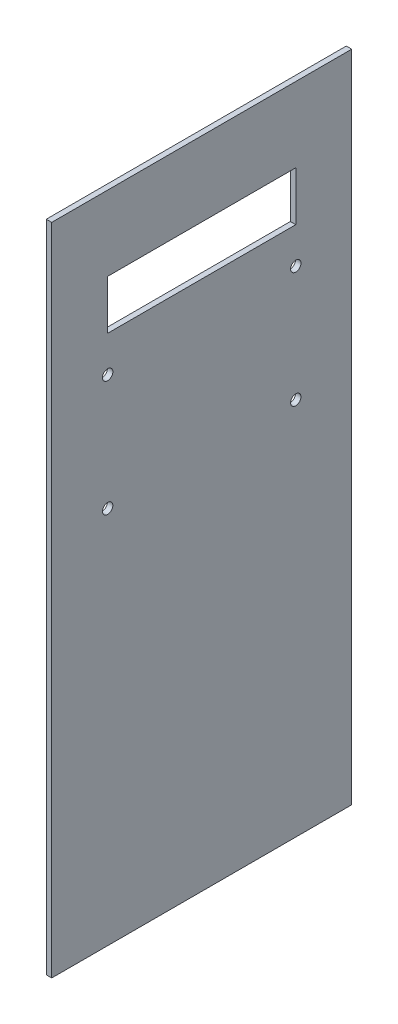
ISO-10303-21;
HEADER;
FILE_DESCRIPTION(('STEP AP214'),'2;1');
FILE_NAME('part.step','',(''),(''),'','','');
FILE_SCHEMA(('AUTOMOTIVE_DESIGN { 1 0 10303 214 1 1 1 1 }'));
ENDSEC;
DATA;
#1=APPLICATION_CONTEXT('core data for automotive mechanical design processes');
#2=APPLICATION_PROTOCOL_DEFINITION('international standard','automotive_design',2000,#1);
#3=PRODUCT_CONTEXT('',#1,'mechanical');
#4=PRODUCT('Part','Part','',(#3));
#5=PRODUCT_RELATED_PRODUCT_CATEGORY('part','',(#4));
#6=PRODUCT_DEFINITION_FORMATION('','',#4);
#7=PRODUCT_DEFINITION_CONTEXT('part definition',#1,'design');
#8=PRODUCT_DEFINITION('design','',#6,#7);
#9=PRODUCT_DEFINITION_SHAPE('','',#8);
#10=(LENGTH_UNIT() NAMED_UNIT(*) SI_UNIT(.MILLI.,.METRE.));
#11=(NAMED_UNIT(*) PLANE_ANGLE_UNIT() SI_UNIT($,.RADIAN.));
#12=(NAMED_UNIT(*) SI_UNIT($,.STERADIAN.) SOLID_ANGLE_UNIT());
#13=UNCERTAINTY_MEASURE_WITH_UNIT(LENGTH_MEASURE(1.E-05),#10,'distance_accuracy_value','');
#14=(GEOMETRIC_REPRESENTATION_CONTEXT(3) GLOBAL_UNCERTAINTY_ASSIGNED_CONTEXT((#13)) GLOBAL_UNIT_ASSIGNED_CONTEXT((#10,
#11,#12)) REPRESENTATION_CONTEXT('',''));
#15=CARTESIAN_POINT('',(0.,0.,0.));
#16=DIRECTION('',(0.,0.,1.));
#17=DIRECTION('',(1.,0.,0.));
#18=AXIS2_PLACEMENT_3D('',#15,#16,#17);
#19=CARTESIAN_POINT('',(3.175,0.,0.));
#20=DIRECTION('',(1.,0.,0.));
#21=DIRECTION('',(0.,0.,-1.));
#22=AXIS2_PLACEMENT_3D('',#19,#20,#21);
#23=PLANE('',#22);
#24=DIRECTION('',(0.,0.,-1.));
#25=VECTOR('',#24,1.);
#26=CARTESIAN_POINT('',(3.175,118.453264384644,-54.834498222839));
#27=LINE('',#26,#25);
#28=CARTESIAN_POINT('',(3.175,118.453264384644,54.8344982228391));
#29=VERTEX_POINT('',#28);
#30=CARTESIAN_POINT('',(3.175,118.453264384644,-54.834498222839));
#31=VERTEX_POINT('',#30);
#32=EDGE_CURVE('E107',#29,#31,#27,.T.);
#33=ORIENTED_EDGE('',*,*,#32,.F.);
#34=DIRECTION('',(0.,-1.,0.));
#35=VECTOR('',#34,1.);
#36=CARTESIAN_POINT('',(3.175,118.453264384644,54.8344982228391));
#37=LINE('',#36,#35);
#38=CARTESIAN_POINT('',(3.175,147.192497833788,54.8344982228391));
#39=VERTEX_POINT('',#38);
#40=EDGE_CURVE('E99',#39,#29,#37,.T.);
#41=ORIENTED_EDGE('',*,*,#40,.F.);
#42=DIRECTION('',(0.,0.,1.));
#43=VECTOR('',#42,1.);
#44=CARTESIAN_POINT('',(3.175,147.192497833788,-54.834498222839));
#45=LINE('',#44,#43);
#46=CARTESIAN_POINT('',(3.175,147.192497833788,-54.834498222839));
#47=VERTEX_POINT('',#46);
#48=EDGE_CURVE('E122',#47,#39,#45,.T.);
#49=ORIENTED_EDGE('',*,*,#48,.F.);
#50=DIRECTION('',(0.,1.,0.));
#51=VECTOR('',#50,1.);
#52=CARTESIAN_POINT('',(3.175,118.453264384644,-54.834498222839));
#53=LINE('',#52,#51);
#54=EDGE_CURVE('E120',#31,#47,#53,.T.);
#55=ORIENTED_EDGE('',*,*,#54,.F.);
#56=EDGE_LOOP('',(#33,#41,#49,#55));
#57=FACE_BOUND('',#56,.T.);
#58=CARTESIAN_POINT('',(3.175,30.0341881161329,54.8344982228391));
#59=DIRECTION('',(1.,0.,0.));
#60=DIRECTION('',(0.,0.,-1.));
#61=AXIS2_PLACEMENT_3D('',#58,#59,#60);
#62=CIRCLE('',#61,3.01562336065672);
#63=CARTESIAN_POINT('',(3.175,30.0341881161329,51.8188748621823));
#64=VERTEX_POINT('',#63);
#65=EDGE_CURVE('E138',#64,#64,#62,.T.);
#66=ORIENTED_EDGE('',*,*,#65,.F.);
#67=EDGE_LOOP('',(#66));
#68=FACE_BOUND('',#67,.T.);
#69=CARTESIAN_POINT('',(3.175,97.5341881161329,-54.834498222839));
#70=DIRECTION('',(1.,0.,0.));
#71=DIRECTION('',(0.,0.,-1.));
#72=AXIS2_PLACEMENT_3D('',#69,#70,#71);
#73=CIRCLE('',#72,3.01562336065672);
#74=CARTESIAN_POINT('',(3.175,97.5341881161329,-57.8501215834958));
#75=VERTEX_POINT('',#74);
#76=EDGE_CURVE('E150',#75,#75,#73,.T.);
#77=ORIENTED_EDGE('',*,*,#76,.F.);
#78=EDGE_LOOP('',(#77));
#79=FACE_BOUND('',#78,.T.);
#80=DIRECTION('',(0.,-1.,0.));
#81=VECTOR('',#80,1.);
#82=CARTESIAN_POINT('',(3.175,-190.7667,87.45982));
#83=LINE('',#82,#81);
#84=CARTESIAN_POINT('',(3.175,190.7667,87.45982));
#85=VERTEX_POINT('',#84);
#86=CARTESIAN_POINT('',(3.175,-190.7667,87.45982));
#87=VERTEX_POINT('',#86);
#88=EDGE_CURVE('E156',#85,#87,#83,.T.);
#89=ORIENTED_EDGE('',*,*,#88,.T.);
#90=DIRECTION('',(0.,0.,-1.));
#91=VECTOR('',#90,1.);
#92=CARTESIAN_POINT('',(3.175,-190.7667,-87.45982));
#93=LINE('',#92,#91);
#94=CARTESIAN_POINT('',(3.175,-190.7667,-87.45982));
#95=VERTEX_POINT('',#94);
#96=EDGE_CURVE('E159',#87,#95,#93,.T.);
#97=ORIENTED_EDGE('',*,*,#96,.T.);
#98=DIRECTION('',(0.,1.,0.));
#99=VECTOR('',#98,1.);
#100=CARTESIAN_POINT('',(3.175,-190.7667,-87.45982));
#101=LINE('',#100,#99);
#102=CARTESIAN_POINT('',(3.175,190.7667,-87.45982));
#103=VERTEX_POINT('',#102);
#104=EDGE_CURVE('E162',#95,#103,#101,.T.);
#105=ORIENTED_EDGE('',*,*,#104,.T.);
#106=DIRECTION('',(0.,0.,1.));
#107=VECTOR('',#106,1.);
#108=CARTESIAN_POINT('',(3.175,190.7667,-87.45982));
#109=LINE('',#108,#107);
#110=EDGE_CURVE('E164',#103,#85,#109,.T.);
#111=ORIENTED_EDGE('',*,*,#110,.T.);
#112=EDGE_LOOP('',(#89,#97,#105,#111));
#113=FACE_BOUND('',#112,.T.);
#114=CARTESIAN_POINT('',(3.175,30.0341881161329,-54.834498222839));
#115=DIRECTION('',(1.,0.,0.));
#116=DIRECTION('',(0.,0.,-1.));
#117=AXIS2_PLACEMENT_3D('',#114,#115,#116);
#118=CIRCLE('',#117,3.01562336065672);
#119=CARTESIAN_POINT('',(3.175,30.0341881161329,-57.8501215834958));
#120=VERTEX_POINT('',#119);
#121=EDGE_CURVE('E144',#120,#120,#118,.T.);
#122=ORIENTED_EDGE('',*,*,#121,.F.);
#123=EDGE_LOOP('',(#122));
#124=FACE_BOUND('',#123,.T.);
#125=CARTESIAN_POINT('',(3.175,97.5341881161329,54.8344982228391));
#126=DIRECTION('',(1.,0.,0.));
#127=DIRECTION('',(0.,0.,-1.));
#128=AXIS2_PLACEMENT_3D('',#125,#126,#127);
#129=CIRCLE('',#128,3.01562336065672);
#130=CARTESIAN_POINT('',(3.175,97.5341881161329,51.8188748621823));
#131=VERTEX_POINT('',#130);
#132=EDGE_CURVE('E128',#131,#131,#129,.T.);
#133=ORIENTED_EDGE('',*,*,#132,.F.);
#134=EDGE_LOOP('',(#133));
#135=FACE_BOUND('',#134,.T.);
#136=ADVANCED_FACE('F34',(#57,#68,#79,#113,#124,#135),#23,.T.);
#137=CARTESIAN_POINT('',(0.,0.,0.));
#138=DIRECTION('',(1.,0.,0.));
#139=DIRECTION('',(0.,0.,-1.));
#140=AXIS2_PLACEMENT_3D('',#137,#138,#139);
#141=PLANE('',#140);
#142=CARTESIAN_POINT('',(0.,30.0341881161329,54.8344982228391));
#143=DIRECTION('',(1.,0.,0.));
#144=DIRECTION('',(0.,0.,-1.));
#145=AXIS2_PLACEMENT_3D('',#142,#143,#144);
#146=CIRCLE('',#145,3.01562336065672);
#147=CARTESIAN_POINT('',(0.,30.0341881161329,51.8188748621823));
#148=VERTEX_POINT('',#147);
#149=EDGE_CURVE('E115',#148,#148,#146,.T.);
#150=ORIENTED_EDGE('',*,*,#149,.T.);
#151=EDGE_LOOP('',(#150));
#152=FACE_BOUND('',#151,.T.);
#153=CARTESIAN_POINT('',(0.,30.0341881161329,-54.834498222839));
#154=DIRECTION('',(1.,0.,0.));
#155=DIRECTION('',(0.,0.,-1.));
#156=AXIS2_PLACEMENT_3D('',#153,#154,#155);
#157=CIRCLE('',#156,3.01562336065672);
#158=CARTESIAN_POINT('',(0.,30.0341881161329,-57.8501215834958));
#159=VERTEX_POINT('',#158);
#160=EDGE_CURVE('E141',#159,#159,#157,.T.);
#161=ORIENTED_EDGE('',*,*,#160,.T.);
#162=EDGE_LOOP('',(#161));
#163=FACE_BOUND('',#162,.T.);
#164=CARTESIAN_POINT('',(0.,97.5341881161329,-54.834498222839));
#165=DIRECTION('',(1.,0.,0.));
#166=DIRECTION('',(0.,0.,-1.));
#167=AXIS2_PLACEMENT_3D('',#164,#165,#166);
#168=CIRCLE('',#167,3.01562336065672);
#169=CARTESIAN_POINT('',(0.,97.5341881161329,-57.8501215834958));
#170=VERTEX_POINT('',#169);
#171=EDGE_CURVE('E147',#170,#170,#168,.T.);
#172=ORIENTED_EDGE('',*,*,#171,.T.);
#173=EDGE_LOOP('',(#172));
#174=FACE_BOUND('',#173,.T.);
#175=DIRECTION('',(0.,-1.,0.));
#176=VECTOR('',#175,1.);
#177=CARTESIAN_POINT('',(0.,-190.7667,87.45982));
#178=LINE('',#177,#176);
#179=CARTESIAN_POINT('',(0.,190.7667,87.45982));
#180=VERTEX_POINT('',#179);
#181=CARTESIAN_POINT('',(0.,-190.7667,87.45982));
#182=VERTEX_POINT('',#181);
#183=EDGE_CURVE('E153',#180,#182,#178,.T.);
#184=ORIENTED_EDGE('',*,*,#183,.F.);
#185=DIRECTION('',(0.,0.,1.));
#186=VECTOR('',#185,1.);
#187=CARTESIAN_POINT('',(0.,190.7667,-87.45982));
#188=LINE('',#187,#186);
#189=CARTESIAN_POINT('',(0.,190.7667,-87.45982));
#190=VERTEX_POINT('',#189);
#191=EDGE_CURVE('E160',#190,#180,#188,.T.);
#192=ORIENTED_EDGE('',*,*,#191,.F.);
#193=DIRECTION('',(0.,1.,0.));
#194=VECTOR('',#193,1.);
#195=CARTESIAN_POINT('',(0.,-190.7667,-87.45982));
#196=LINE('',#195,#194);
#197=CARTESIAN_POINT('',(0.,-190.7667,-87.45982));
#198=VERTEX_POINT('',#197);
#199=EDGE_CURVE('E171',#198,#190,#196,.T.);
#200=ORIENTED_EDGE('',*,*,#199,.F.);
#201=DIRECTION('',(0.,0.,-1.));
#202=VECTOR('',#201,1.);
#203=CARTESIAN_POINT('',(0.,-190.7667,-87.45982));
#204=LINE('',#203,#202);
#205=EDGE_CURVE('E169',#182,#198,#204,.T.);
#206=ORIENTED_EDGE('',*,*,#205,.F.);
#207=EDGE_LOOP('',(#184,#192,#200,#206));
#208=FACE_BOUND('',#207,.T.);
#209=DIRECTION('',(0.,-1.,0.));
#210=VECTOR('',#209,1.);
#211=CARTESIAN_POINT('',(0.,118.453264384644,54.8344982228391));
#212=LINE('',#211,#210);
#213=CARTESIAN_POINT('',(0.,147.192497833788,54.8344982228391));
#214=VERTEX_POINT('',#213);
#215=CARTESIAN_POINT('',(0.,118.453264384644,54.8344982228391));
#216=VERTEX_POINT('',#215);
#217=EDGE_CURVE('E57',#214,#216,#212,.T.);
#218=ORIENTED_EDGE('',*,*,#217,.T.);
#219=DIRECTION('',(0.,0.,-1.));
#220=VECTOR('',#219,1.);
#221=CARTESIAN_POINT('',(0.,118.453264384644,-54.834498222839));
#222=LINE('',#221,#220);
#223=CARTESIAN_POINT('',(0.,118.453264384644,-54.834498222839));
#224=VERTEX_POINT('',#223);
#225=EDGE_CURVE('E114',#216,#224,#222,.T.);
#226=ORIENTED_EDGE('',*,*,#225,.T.);
#227=DIRECTION('',(0.,1.,0.));
#228=VECTOR('',#227,1.);
#229=CARTESIAN_POINT('',(0.,118.453264384644,-54.834498222839));
#230=LINE('',#229,#228);
#231=CARTESIAN_POINT('',(0.,147.192497833788,-54.834498222839));
#232=VERTEX_POINT('',#231);
#233=EDGE_CURVE('E130',#224,#232,#230,.T.);
#234=ORIENTED_EDGE('',*,*,#233,.T.);
#235=DIRECTION('',(0.,0.,1.));
#236=VECTOR('',#235,1.);
#237=CARTESIAN_POINT('',(0.,147.192497833788,-54.834498222839));
#238=LINE('',#237,#236);
#239=EDGE_CURVE('E108',#232,#214,#238,.T.);
#240=ORIENTED_EDGE('',*,*,#239,.T.);
#241=EDGE_LOOP('',(#218,#226,#234,#240));
#242=FACE_BOUND('',#241,.T.);
#243=CARTESIAN_POINT('',(0.,97.5341881161329,54.8344982228391));
#244=DIRECTION('',(1.,0.,0.));
#245=DIRECTION('',(0.,0.,-1.));
#246=AXIS2_PLACEMENT_3D('',#243,#244,#245);
#247=CIRCLE('',#246,3.01562336065672);
#248=CARTESIAN_POINT('',(0.,97.5341881161329,51.8188748621823));
#249=VERTEX_POINT('',#248);
#250=EDGE_CURVE('E262',#249,#249,#247,.T.);
#251=ORIENTED_EDGE('',*,*,#250,.T.);
#252=EDGE_LOOP('',(#251));
#253=FACE_BOUND('',#252,.T.);
#254=ADVANCED_FACE('F189',(#152,#163,#174,#208,#242,#253),#141,.F.);
#255=CARTESIAN_POINT('',(3.175,-190.7667,87.45982));
#256=DIRECTION('',(0.,0.,-1.));
#257=DIRECTION('',(-1.,0.,0.));
#258=AXIS2_PLACEMENT_3D('',#255,#256,#257);
#259=PLANE('',#258);
#260=ORIENTED_EDGE('',*,*,#183,.T.);
#261=DIRECTION('',(-1.,0.,0.));
#262=VECTOR('',#261,1.);
#263=CARTESIAN_POINT('',(3.175,-190.7667,87.45982));
#264=LINE('',#263,#262);
#265=EDGE_CURVE('E11',#87,#182,#264,.T.);
#266=ORIENTED_EDGE('',*,*,#265,.F.);
#267=ORIENTED_EDGE('',*,*,#88,.F.);
#268=DIRECTION('',(-1.,0.,0.));
#269=VECTOR('',#268,1.);
#270=CARTESIAN_POINT('',(3.175,190.7667,87.45982));
#271=LINE('',#270,#269);
#272=EDGE_CURVE('E166',#85,#180,#271,.T.);
#273=ORIENTED_EDGE('',*,*,#272,.T.);
#274=EDGE_LOOP('',(#260,#266,#267,#273));
#275=FACE_BOUND('',#274,.T.);
#276=ADVANCED_FACE('F36',(#275),#259,.F.);
#277=CARTESIAN_POINT('',(3.175,-190.7667,-87.45982));
#278=DIRECTION('',(0.,1.,0.));
#279=DIRECTION('',(0.,0.,1.));
#280=AXIS2_PLACEMENT_3D('',#277,#278,#279);
#281=PLANE('',#280);
#282=ORIENTED_EDGE('',*,*,#205,.T.);
#283=DIRECTION('',(-1.,0.,0.));
#284=VECTOR('',#283,1.);
#285=CARTESIAN_POINT('',(3.175,-190.7667,-87.45982));
#286=LINE('',#285,#284);
#287=EDGE_CURVE('E42',#95,#198,#286,.T.);
#288=ORIENTED_EDGE('',*,*,#287,.F.);
#289=ORIENTED_EDGE('',*,*,#96,.F.);
#290=ORIENTED_EDGE('',*,*,#265,.T.);
#291=EDGE_LOOP('',(#282,#288,#289,#290));
#292=FACE_BOUND('',#291,.T.);
#293=ADVANCED_FACE('F200',(#292),#281,.F.);
#294=CARTESIAN_POINT('',(3.175,-190.7667,-87.45982));
#295=DIRECTION('',(0.,0.,1.));
#296=DIRECTION('',(1.,0.,0.));
#297=AXIS2_PLACEMENT_3D('',#294,#295,#296);
#298=PLANE('',#297);
#299=ORIENTED_EDGE('',*,*,#199,.T.);
#300=DIRECTION('',(-1.,0.,0.));
#301=VECTOR('',#300,1.);
#302=CARTESIAN_POINT('',(3.175,190.7667,-87.45982));
#303=LINE('',#302,#301);
#304=EDGE_CURVE('E176',#103,#190,#303,.T.);
#305=ORIENTED_EDGE('',*,*,#304,.F.);
#306=ORIENTED_EDGE('',*,*,#104,.F.);
#307=ORIENTED_EDGE('',*,*,#287,.T.);
#308=EDGE_LOOP('',(#299,#305,#306,#307));
#309=FACE_BOUND('',#308,.T.);
#310=ADVANCED_FACE('F183',(#309),#298,.F.);
#311=CARTESIAN_POINT('',(3.175,190.7667,-87.45982));
#312=DIRECTION('',(0.,-1.,0.));
#313=DIRECTION('',(0.,0.,-1.));
#314=AXIS2_PLACEMENT_3D('',#311,#312,#313);
#315=PLANE('',#314);
#316=ORIENTED_EDGE('',*,*,#191,.T.);
#317=ORIENTED_EDGE('',*,*,#272,.F.);
#318=ORIENTED_EDGE('',*,*,#110,.F.);
#319=ORIENTED_EDGE('',*,*,#304,.T.);
#320=EDGE_LOOP('',(#316,#317,#318,#319));
#321=FACE_BOUND('',#320,.T.);
#322=ADVANCED_FACE('F193',(#321),#315,.F.);
#323=CARTESIAN_POINT('',(3.175,97.5341881161329,-54.834498222839));
#324=DIRECTION('',(-1.,0.,0.));
#325=DIRECTION('',(0.,0.,1.));
#326=AXIS2_PLACEMENT_3D('',#323,#324,#325);
#327=CYLINDRICAL_SURFACE('',#326,3.01562336065672);
#328=ORIENTED_EDGE('',*,*,#76,.T.);
#329=EDGE_LOOP('',(#328));
#330=FACE_BOUND('',#329,.T.);
#331=ORIENTED_EDGE('',*,*,#171,.F.);
#332=EDGE_LOOP('',(#331));
#333=FACE_BOUND('',#332,.T.);
#334=ADVANCED_FACE('F215',(#330,#333),#327,.F.);
#335=CARTESIAN_POINT('',(3.175,30.0341881161329,-54.834498222839));
#336=DIRECTION('',(-1.,0.,0.));
#337=DIRECTION('',(0.,0.,1.));
#338=AXIS2_PLACEMENT_3D('',#335,#336,#337);
#339=CYLINDRICAL_SURFACE('',#338,3.01562336065672);
#340=ORIENTED_EDGE('',*,*,#121,.T.);
#341=EDGE_LOOP('',(#340));
#342=FACE_BOUND('',#341,.T.);
#343=ORIENTED_EDGE('',*,*,#160,.F.);
#344=EDGE_LOOP('',(#343));
#345=FACE_BOUND('',#344,.T.);
#346=ADVANCED_FACE('F222',(#342,#345),#339,.F.);
#347=CARTESIAN_POINT('',(3.175,30.0341881161329,54.8344982228391));
#348=DIRECTION('',(-1.,0.,0.));
#349=DIRECTION('',(0.,0.,1.));
#350=AXIS2_PLACEMENT_3D('',#347,#348,#349);
#351=CYLINDRICAL_SURFACE('',#350,3.01562336065672);
#352=ORIENTED_EDGE('',*,*,#65,.T.);
#353=EDGE_LOOP('',(#352));
#354=FACE_BOUND('',#353,.T.);
#355=ORIENTED_EDGE('',*,*,#149,.F.);
#356=EDGE_LOOP('',(#355));
#357=FACE_BOUND('',#356,.T.);
#358=ADVANCED_FACE('F227',(#354,#357),#351,.F.);
#359=CARTESIAN_POINT('',(3.175,118.453264384644,54.8344982228391));
#360=DIRECTION('',(0.,0.,-1.));
#361=DIRECTION('',(-1.,0.,0.));
#362=AXIS2_PLACEMENT_3D('',#359,#360,#361);
#363=PLANE('',#362);
#364=ORIENTED_EDGE('',*,*,#217,.F.);
#365=DIRECTION('',(-1.,0.,0.));
#366=VECTOR('',#365,1.);
#367=CARTESIAN_POINT('',(3.175,147.192497833788,54.8344982228391));
#368=LINE('',#367,#366);
#369=EDGE_CURVE('E103',#39,#214,#368,.T.);
#370=ORIENTED_EDGE('',*,*,#369,.F.);
#371=ORIENTED_EDGE('',*,*,#40,.T.);
#372=DIRECTION('',(-1.,0.,0.));
#373=VECTOR('',#372,1.);
#374=CARTESIAN_POINT('',(3.175,118.453264384644,54.8344982228391));
#375=LINE('',#374,#373);
#376=EDGE_CURVE('E102',#29,#216,#375,.T.);
#377=ORIENTED_EDGE('',*,*,#376,.T.);
#378=EDGE_LOOP('',(#364,#370,#371,#377));
#379=FACE_BOUND('',#378,.T.);
#380=ADVANCED_FACE('F101',(#379),#363,.T.);
#381=CARTESIAN_POINT('',(3.175,118.453264384644,-54.834498222839));
#382=DIRECTION('',(0.,1.,0.));
#383=DIRECTION('',(0.,0.,1.));
#384=AXIS2_PLACEMENT_3D('',#381,#382,#383);
#385=PLANE('',#384);
#386=ORIENTED_EDGE('',*,*,#225,.F.);
#387=ORIENTED_EDGE('',*,*,#376,.F.);
#388=ORIENTED_EDGE('',*,*,#32,.T.);
#389=DIRECTION('',(-1.,0.,0.));
#390=VECTOR('',#389,1.);
#391=CARTESIAN_POINT('',(3.175,118.453264384644,-54.834498222839));
#392=LINE('',#391,#390);
#393=EDGE_CURVE('E116',#31,#224,#392,.T.);
#394=ORIENTED_EDGE('',*,*,#393,.T.);
#395=EDGE_LOOP('',(#386,#387,#388,#394));
#396=FACE_BOUND('',#395,.T.);
#397=ADVANCED_FACE('F111',(#396),#385,.T.);
#398=CARTESIAN_POINT('',(3.175,118.453264384644,-54.834498222839));
#399=DIRECTION('',(0.,0.,1.));
#400=DIRECTION('',(1.,0.,0.));
#401=AXIS2_PLACEMENT_3D('',#398,#399,#400);
#402=PLANE('',#401);
#403=ORIENTED_EDGE('',*,*,#233,.F.);
#404=ORIENTED_EDGE('',*,*,#393,.F.);
#405=ORIENTED_EDGE('',*,*,#54,.T.);
#406=DIRECTION('',(-1.,0.,0.));
#407=VECTOR('',#406,1.);
#408=CARTESIAN_POINT('',(3.175,147.192497833788,-54.834498222839));
#409=LINE('',#408,#407);
#410=EDGE_CURVE('E49',#47,#232,#409,.T.);
#411=ORIENTED_EDGE('',*,*,#410,.T.);
#412=EDGE_LOOP('',(#403,#404,#405,#411));
#413=FACE_BOUND('',#412,.T.);
#414=ADVANCED_FACE('F245',(#413),#402,.T.);
#415=CARTESIAN_POINT('',(3.175,147.192497833788,-54.834498222839));
#416=DIRECTION('',(0.,-1.,0.));
#417=DIRECTION('',(0.,0.,-1.));
#418=AXIS2_PLACEMENT_3D('',#415,#416,#417);
#419=PLANE('',#418);
#420=ORIENTED_EDGE('',*,*,#239,.F.);
#421=ORIENTED_EDGE('',*,*,#410,.F.);
#422=ORIENTED_EDGE('',*,*,#48,.T.);
#423=ORIENTED_EDGE('',*,*,#369,.T.);
#424=EDGE_LOOP('',(#420,#421,#422,#423));
#425=FACE_BOUND('',#424,.T.);
#426=ADVANCED_FACE('F248',(#425),#419,.T.);
#427=CARTESIAN_POINT('',(3.175,97.5341881161329,54.8344982228391));
#428=DIRECTION('',(-1.,0.,0.));
#429=DIRECTION('',(0.,0.,1.));
#430=AXIS2_PLACEMENT_3D('',#427,#428,#429);
#431=CYLINDRICAL_SURFACE('',#430,3.01562336065672);
#432=ORIENTED_EDGE('',*,*,#132,.T.);
#433=EDGE_LOOP('',(#432));
#434=FACE_BOUND('',#433,.T.);
#435=ORIENTED_EDGE('',*,*,#250,.F.);
#436=EDGE_LOOP('',(#435));
#437=FACE_BOUND('',#436,.T.);
#438=ADVANCED_FACE('F252',(#434,#437),#431,.F.);
#439=CLOSED_SHELL('',(#136,#254,#276,#293,#310,#322,#334,#346,#358,#380,#397,#414,#426,#438));
#440=MANIFOLD_SOLID_BREP('B2',#439);
#441=ADVANCED_BREP_SHAPE_REPRESENTATION('',(#18,#440),#14);
#442=SHAPE_DEFINITION_REPRESENTATION(#9,#441);
ENDSEC;
END-ISO-10303-21;
